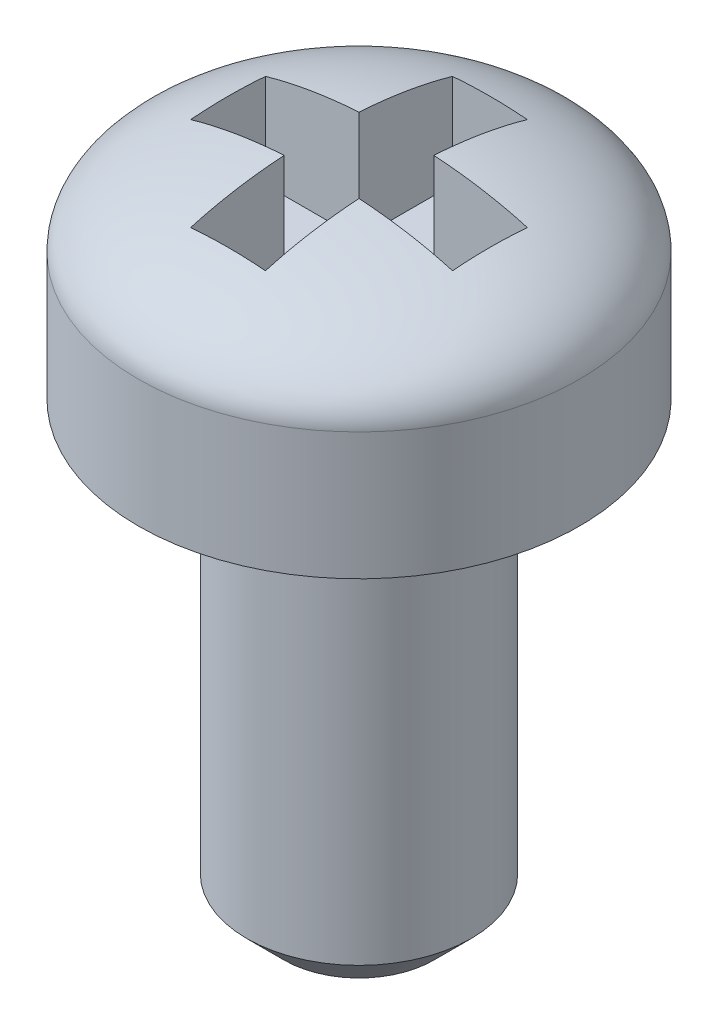
ISO-10303-21;
HEADER;
FILE_DESCRIPTION(('STEP AP214'),'2;1');
FILE_NAME('part.step','',(''),(''),'','','');
FILE_SCHEMA(('AUTOMOTIVE_DESIGN { 1 0 10303 214 1 1 1 1 }'));
ENDSEC;
DATA;
#1=APPLICATION_CONTEXT('core data for automotive mechanical design processes');
#2=APPLICATION_PROTOCOL_DEFINITION('international standard','automotive_design',2000,#1);
#3=PRODUCT_CONTEXT('',#1,'mechanical');
#4=PRODUCT('Part','Part','',(#3));
#5=PRODUCT_RELATED_PRODUCT_CATEGORY('part','',(#4));
#6=PRODUCT_DEFINITION_FORMATION('','',#4);
#7=PRODUCT_DEFINITION_CONTEXT('part definition',#1,'design');
#8=PRODUCT_DEFINITION('design','',#6,#7);
#9=PRODUCT_DEFINITION_SHAPE('','',#8);
#10=(LENGTH_UNIT() NAMED_UNIT(*) SI_UNIT(.MILLI.,.METRE.));
#11=(NAMED_UNIT(*) PLANE_ANGLE_UNIT() SI_UNIT($,.RADIAN.));
#12=(NAMED_UNIT(*) SI_UNIT($,.STERADIAN.) SOLID_ANGLE_UNIT());
#13=UNCERTAINTY_MEASURE_WITH_UNIT(LENGTH_MEASURE(1.E-05),#10,'distance_accuracy_value','');
#14=(GEOMETRIC_REPRESENTATION_CONTEXT(3) GLOBAL_UNCERTAINTY_ASSIGNED_CONTEXT((#13)) GLOBAL_UNIT_ASSIGNED_CONTEXT((#10,
#11,#12)) REPRESENTATION_CONTEXT('',''));
#15=CARTESIAN_POINT('',(0.,0.,0.));
#16=DIRECTION('',(0.,0.,1.));
#17=DIRECTION('',(1.,0.,0.));
#18=AXIS2_PLACEMENT_3D('',#15,#16,#17);
#19=CARTESIAN_POINT('',(-1.5,-2.85,0.));
#20=DIRECTION('',(0.,-1.,0.));
#21=DIRECTION('',(0.,0.,-1.));
#22=AXIS2_PLACEMENT_3D('',#19,#20,#21);
#23=PLANE('',#22);
#24=CARTESIAN_POINT('',(0.,-2.85,0.));
#25=DIRECTION('',(0.,1.,0.));
#26=DIRECTION('',(0.,0.,1.));
#27=AXIS2_PLACEMENT_3D('',#24,#25,#26);
#28=CIRCLE('',#27,1.5);
#29=CARTESIAN_POINT('',(0.,-2.85,1.5));
#30=VERTEX_POINT('',#29);
#31=EDGE_CURVE('E349',#30,#30,#28,.T.);
#32=ORIENTED_EDGE('',*,*,#31,.T.);
#33=EDGE_LOOP('',(#32));
#34=FACE_BOUND('',#33,.T.);
#35=CARTESIAN_POINT('',(0.,-2.85,0.));
#36=DIRECTION('',(0.,1.,0.));
#37=DIRECTION('',(0.,0.,1.));
#38=AXIS2_PLACEMENT_3D('',#35,#36,#37);
#39=CIRCLE('',#38,2.95);
#40=CARTESIAN_POINT('',(0.,-2.85,2.95));
#41=VERTEX_POINT('',#40);
#42=EDGE_CURVE('E174',#41,#41,#39,.T.);
#43=ORIENTED_EDGE('',*,*,#42,.F.);
#44=EDGE_LOOP('',(#43));
#45=FACE_BOUND('',#44,.T.);
#46=ADVANCED_FACE('F33',(#34,#45),#23,.T.);
#47=CARTESIAN_POINT('',(0.,0.,0.));
#48=DIRECTION('',(0.,1.,0.));
#49=DIRECTION('',(0.,0.,1.));
#50=AXIS2_PLACEMENT_3D('',#47,#48,#49);
#51=CYLINDRICAL_SURFACE('',#50,1.5);
#52=CARTESIAN_POINT('',(0.,-8.35,0.));
#53=DIRECTION('',(0.,1.,0.));
#54=DIRECTION('',(0.,0.,1.));
#55=AXIS2_PLACEMENT_3D('',#52,#53,#54);
#56=CIRCLE('',#55,1.5);
#57=CARTESIAN_POINT('',(0.,-8.35,1.5));
#58=VERTEX_POINT('',#57);
#59=EDGE_CURVE('E358',#58,#58,#56,.T.);
#60=ORIENTED_EDGE('',*,*,#59,.T.);
#61=EDGE_LOOP('',(#60));
#62=FACE_BOUND('',#61,.T.);
#63=ORIENTED_EDGE('',*,*,#31,.F.);
#64=EDGE_LOOP('',(#63));
#65=FACE_BOUND('',#64,.T.);
#66=ADVANCED_FACE('F339',(#62,#65),#51,.T.);
#67=CARTESIAN_POINT('',(0.,-8.35,0.));
#68=DIRECTION('',(0.,1.,0.));
#69=DIRECTION('',(0.,0.,1.));
#70=AXIS2_PLACEMENT_3D('',#67,#68,#69);
#71=CONICAL_SURFACE('',#70,1.5,0.785398163397448);
#72=CARTESIAN_POINT('',(0.,-8.85,0.));
#73=DIRECTION('',(0.,1.,0.));
#74=DIRECTION('',(0.,0.,1.));
#75=AXIS2_PLACEMENT_3D('',#72,#73,#74);
#76=CIRCLE('',#75,1.);
#77=CARTESIAN_POINT('',(0.,-8.85,1.));
#78=VERTEX_POINT('',#77);
#79=EDGE_CURVE('E354',#78,#78,#76,.T.);
#80=ORIENTED_EDGE('',*,*,#79,.T.);
#81=EDGE_LOOP('',(#80));
#82=FACE_BOUND('',#81,.T.);
#83=ORIENTED_EDGE('',*,*,#59,.F.);
#84=EDGE_LOOP('',(#83));
#85=FACE_BOUND('',#84,.T.);
#86=ADVANCED_FACE('F344',(#82,#85),#71,.T.);
#87=CARTESIAN_POINT('',(-1.,-8.85,0.));
#88=DIRECTION('',(0.,-1.,0.));
#89=DIRECTION('',(0.,0.,-1.));
#90=AXIS2_PLACEMENT_3D('',#87,#88,#89);
#91=PLANE('',#90);
#92=ORIENTED_EDGE('',*,*,#79,.F.);
#93=EDGE_LOOP('',(#92));
#94=FACE_BOUND('',#93,.T.);
#95=ADVANCED_FACE('F211',(#94),#91,.T.);
#96=CARTESIAN_POINT('',(0.,-1.15,0.));
#97=DIRECTION('',(0.,0.,1.));
#98=DIRECTION('',(-1.,0.,0.));
#99=AXIS2_PLACEMENT_3D('',#96,#97,#98);
#100=ELLIPSE('',#99,2.95,1.15);
#101=TRIMMED_CURVE('',#100,(PARAMETER_VALUE(4.71238898038469)),
(PARAMETER_VALUE(7.85398163397448)),.T.,.PARAMETER.);
#102=CARTESIAN_POINT('',(0.,0.,0.));
#103=DIRECTION('',(0.,1.,0.));
#104=AXIS1_PLACEMENT('',#102,#103);
#105=SURFACE_OF_REVOLUTION('',#101,#104);
#106=CARTESIAN_POINT('',(-1.75,-0.244954930089459,-0.5));
#107=CARTESIAN_POINT('',(-1.75,-0.239055899217544,-0.429623773528876));
#108=CARTESIAN_POINT('',(-1.75,-0.234434513188987,-0.359142635173549));
#109=CARTESIAN_POINT('',(-1.75,-0.227695705444164,-0.218052982729986));
#110=CARTESIAN_POINT('',(-1.75,-0.225578547700344,-0.147444455999186));
#111=CARTESIAN_POINT('',(-1.75,-0.22380070777497,-0.00640476636160792));
#112=CARTESIAN_POINT('',(-1.75,-0.224132829299537,0.0640263084066678));
#113=CARTESIAN_POINT('',(-1.75,-0.227243520783589,0.204829284209098));
#114=CARTESIAN_POINT('',(-1.75,-0.230021863146145,0.275201190138651));
#115=CARTESIAN_POINT('',(-1.75,-0.23700953045186,0.397045446650267));
#116=CARTESIAN_POINT('',(-1.75,-0.240639394362753,0.4485515688106));
#117=CARTESIAN_POINT('',(-1.75,-0.244954930089459,0.5));
#118=B_SPLINE_CURVE_WITH_KNOTS('',3,(#106,#107,#108,#109,#110,#111,#112,#113,#114,#115,#116,
#117),.UNSPECIFIED.,.F.,.F.,(4,2,2,2,2,4),(0.,0.211854281950329,0.423730893618407,
0.634985233414471,0.846219920136794,1.00110398992635),.UNSPECIFIED.);
#119=CARTESIAN_POINT('',(-1.75,-0.244954930089459,-0.5));
#120=VERTEX_POINT('',#119);
#121=CARTESIAN_POINT('',(-1.75,-0.244954930089458,0.5));
#122=VERTEX_POINT('',#121);
#123=EDGE_CURVE('E11',#120,#122,#118,.T.);
#124=ORIENTED_EDGE('',*,*,#123,.F.);
#125=CARTESIAN_POINT('',(-0.500000000000001,-0.0335251515008382,-0.5));
#126=CARTESIAN_POINT('',(-0.552921909872911,-0.0371288185947735,-0.5));
#127=CARTESIAN_POINT('',(-0.605805176989744,-0.0413153124035571,-0.5));
#128=CARTESIAN_POINT('',(-0.71135875930839,-0.0508848716837407,-0.5));
#129=CARTESIAN_POINT('',(-0.764029288729441,-0.0562655779373815,-0.5));
#130=CARTESIAN_POINT('',(-0.869153931793603,-0.0682596903272732,-0.5));
#131=CARTESIAN_POINT('',(-0.921608247327322,-0.0748713203811506,-0.5));
#132=CARTESIAN_POINT('',(-1.02629435328404,-0.0893812865474052,-0.5));
#133=CARTESIAN_POINT('',(-1.07852629323845,-0.0972785408067306,-0.5));
#134=CARTESIAN_POINT('',(-1.18278497192408,-0.114434997072018,-0.5));
#135=CARTESIAN_POINT('',(-1.2348116352868,-0.123694658758267,-0.5));
#136=CARTESIAN_POINT('',(-1.33861697899558,-0.143666671988368,-0.5));
#137=CARTESIAN_POINT('',(-1.39039550065037,-0.154379850609543,-0.5));
#138=CARTESIAN_POINT('',(-1.49367981674456,-0.17737716054057,-0.5));
#139=CARTESIAN_POINT('',(-1.5451851355688,-0.189663441752911,-0.5));
#140=CARTESIAN_POINT('',(-1.64788316046347,-0.215972267379013,-0.5));
#141=CARTESIAN_POINT('',(-1.69907479965767,-0.229998967571266,-0.5));
#142=CARTESIAN_POINT('',(-1.75,-0.244954930089459,-0.500000000000001));
#143=B_SPLINE_CURVE_WITH_KNOTS('',3,(#125,#126,#127,#128,#129,#130,#131,#132,#133,#134,#135,
#136,#137,#138,#139,#140,#141,#142),.UNSPECIFIED.,.F.,.F.,(4,2,2,2,2,2,2,2,4),(0.,
0.159131693146851,0.317951769650337,0.476544438411719,0.63500433478115,0.793517819115162,
0.952121881747135,1.11094506390786,1.27015505874565),.UNSPECIFIED.);
#144=CARTESIAN_POINT('',(-0.5,-0.0335251515008383,-0.5));
#145=VERTEX_POINT('',#144);
#146=EDGE_CURVE('E45',#145,#120,#143,.T.);
#147=ORIENTED_EDGE('',*,*,#146,.F.);
#148=CARTESIAN_POINT('',(-0.5,-0.244954930089459,-1.75));
#149=CARTESIAN_POINT('',(-0.5,-0.225028807203924,-1.68210807496917));
#150=CARTESIAN_POINT('',(-0.5,-0.206738491718709,-1.61375401571976));
#151=CARTESIAN_POINT('',(-0.5,-0.173121024484581,-1.47634042612548));
#152=CARTESIAN_POINT('',(-0.5,-0.157792977452925,-1.40728111559209));
#153=CARTESIAN_POINT('',(-0.5,-0.129829463786077,-1.268879725861));
#154=CARTESIAN_POINT('',(-0.5,-0.117184663373122,-1.19953951133483));
#155=CARTESIAN_POINT('',(-0.5,-0.09431310374636,-1.06046010033589));
#156=CARTESIAN_POINT('',(-0.500000000000001,-0.0840864415700362,-0.990720887966706));
#157=CARTESIAN_POINT('',(-0.500000000000001,-0.0658977167848406,-0.850998112078851));
#158=CARTESIAN_POINT('',(-0.500000000000001,-0.0579341197011642,-0.781014746857256));
#159=CARTESIAN_POINT('',(-0.5,-0.0441442644246511,-0.640709948748605));
#160=CARTESIAN_POINT('',(-0.5,-0.0383218800814352,-0.570388134052562));
#161=CARTESIAN_POINT('',(-0.499999999999999,-0.0335251515008381,-0.5));
#162=B_SPLINE_CURVE_WITH_KNOTS('',3,(#148,#149,#150,#151,#152,#153,#154,#155,#156,#157,#158,
#159,#160,#161),.UNSPECIFIED.,.F.,.F.,(4,2,2,2,2,2,4),(0.,0.212221475197498,0.424378710309311,
0.635785390898001,0.847200553587461,1.0584720219827,1.27012386071645),.UNSPECIFIED.);
#163=CARTESIAN_POINT('',(-0.5,-0.244954930089459,-1.75));
#164=VERTEX_POINT('',#163);
#165=EDGE_CURVE('E281',#164,#145,#162,.T.);
#166=ORIENTED_EDGE('',*,*,#165,.F.);
#167=CARTESIAN_POINT('',(0.499999999999999,-0.244954930089459,-1.75));
#168=CARTESIAN_POINT('',(0.429623773528875,-0.239055899217544,-1.75));
#169=CARTESIAN_POINT('',(0.359142635173548,-0.234434513188987,-1.75));
#170=CARTESIAN_POINT('',(0.218052982729985,-0.227695705444164,-1.75));
#171=CARTESIAN_POINT('',(0.147444455999185,-0.225578547700344,-1.75));
#172=CARTESIAN_POINT('',(0.00640476636160687,-0.22380070777497,-1.75));
#173=CARTESIAN_POINT('',(-0.064026308406669,-0.224132829299537,-1.75));
#174=CARTESIAN_POINT('',(-0.204829284209099,-0.227243520783589,-1.75));
#175=CARTESIAN_POINT('',(-0.275201190138652,-0.230021863146145,-1.75));
#176=CARTESIAN_POINT('',(-0.397045446650268,-0.23700953045186,-1.75));
#177=CARTESIAN_POINT('',(-0.4485515688106,-0.240639394362753,-1.75));
#178=CARTESIAN_POINT('',(-0.5,-0.244954930089459,-1.75));
#179=B_SPLINE_CURVE_WITH_KNOTS('',3,(#167,#168,#169,#170,#171,#172,#173,#174,#175,#176,#177,
#178),.UNSPECIFIED.,.F.,.F.,(4,2,2,2,2,4),(0.,0.211854281950329,0.423730893618408,
0.634985233414471,0.846219920136795,1.00110398992635),.UNSPECIFIED.);
#180=CARTESIAN_POINT('',(0.5,-0.244954930089459,-1.75));
#181=VERTEX_POINT('',#180);
#182=EDGE_CURVE('E275',#181,#164,#179,.T.);
#183=ORIENTED_EDGE('',*,*,#182,.F.);
#184=CARTESIAN_POINT('',(0.499999999999998,-0.0335251515008377,-0.500000000000002));
#185=CARTESIAN_POINT('',(0.499999999999999,-0.0371288185947734,-0.552921909872912));
#186=CARTESIAN_POINT('',(0.499999999999999,-0.0413153124035571,-0.605805176989744));
#187=CARTESIAN_POINT('',(0.5,-0.0508848716837408,-0.711358759308391));
#188=CARTESIAN_POINT('',(0.5,-0.0562655779373816,-0.764029288729441));
#189=CARTESIAN_POINT('',(0.5,-0.0682596903272732,-0.869153931793603));
#190=CARTESIAN_POINT('',(0.5,-0.0748713203811506,-0.921608247327323));
#191=CARTESIAN_POINT('',(0.5,-0.0893812865474052,-1.02629435328404));
#192=CARTESIAN_POINT('',(0.5,-0.0972785408067306,-1.07852629323845));
#193=CARTESIAN_POINT('',(0.5,-0.114434997072018,-1.18278497192408));
#194=CARTESIAN_POINT('',(0.5,-0.123694658758267,-1.2348116352868));
#195=CARTESIAN_POINT('',(0.5,-0.143666671988368,-1.33861697899558));
#196=CARTESIAN_POINT('',(0.5,-0.154379850609543,-1.39039550065037));
#197=CARTESIAN_POINT('',(0.5,-0.17737716054057,-1.49367981674456));
#198=CARTESIAN_POINT('',(0.5,-0.189663441752911,-1.5451851355688));
#199=CARTESIAN_POINT('',(0.5,-0.215972267379013,-1.64788316046347));
#200=CARTESIAN_POINT('',(0.499999999999999,-0.229998967571266,-1.69907479965767));
#201=CARTESIAN_POINT('',(0.499999999999999,-0.244954930089459,-1.75));
#202=B_SPLINE_CURVE_WITH_KNOTS('',3,(#184,#185,#186,#187,#188,#189,#190,#191,#192,#193,#194,
#195,#196,#197,#198,#199,#200,#201),.UNSPECIFIED.,.F.,.F.,(4,2,2,2,2,2,2,2,4),(0.,
0.159131693146851,0.317951769650337,0.476544438411719,0.63500433478115,0.793517819115163,
0.952121881747135,1.11094506390786,1.27015505874565),.UNSPECIFIED.);
#203=CARTESIAN_POINT('',(0.5,-0.0335251515008377,-0.5));
#204=VERTEX_POINT('',#203);
#205=EDGE_CURVE('E268',#204,#181,#202,.T.);
#206=ORIENTED_EDGE('',*,*,#205,.F.);
#207=CARTESIAN_POINT('',(1.75,-0.244954930089459,-0.5));
#208=CARTESIAN_POINT('',(1.68210807496917,-0.225028807203924,-0.5));
#209=CARTESIAN_POINT('',(1.61375401571976,-0.206738491718708,-0.5));
#210=CARTESIAN_POINT('',(1.47634042612548,-0.173121024484581,-0.5));
#211=CARTESIAN_POINT('',(1.40728111559209,-0.157792977452925,-0.5));
#212=CARTESIAN_POINT('',(1.268879725861,-0.129829463786077,-0.5));
#213=CARTESIAN_POINT('',(1.19953951133483,-0.117184663373122,-0.5));
#214=CARTESIAN_POINT('',(1.06046010033589,-0.0943131037463599,-0.5));
#215=CARTESIAN_POINT('',(0.990720887966706,-0.0840864415700362,-0.5));
#216=CARTESIAN_POINT('',(0.850998112078851,-0.0658977167848406,-0.5));
#217=CARTESIAN_POINT('',(0.781014746857255,-0.0579341197011641,-0.5));
#218=CARTESIAN_POINT('',(0.640709948748603,-0.0441442644246508,-0.499999999999999));
#219=CARTESIAN_POINT('',(0.570388134052559,-0.0383218800814348,-0.499999999999999));
#220=CARTESIAN_POINT('',(0.499999999999997,-0.0335251515008377,-0.499999999999999));
#221=B_SPLINE_CURVE_WITH_KNOTS('',3,(#207,#208,#209,#210,#211,#212,#213,#214,#215,#216,#217,
#218,#219,#220),.UNSPECIFIED.,.F.,.F.,(4,2,2,2,2,2,4),(0.,0.212221475197498,0.424378710309311,
0.635785390898001,0.847200553587461,1.0584720219827,1.27012386071645),.UNSPECIFIED.);
#222=CARTESIAN_POINT('',(1.75,-0.244954930089459,-0.5));
#223=VERTEX_POINT('',#222);
#224=EDGE_CURVE('E261',#223,#204,#221,.T.);
#225=ORIENTED_EDGE('',*,*,#224,.F.);
#226=CARTESIAN_POINT('',(1.75,-0.244954930089459,0.5));
#227=CARTESIAN_POINT('',(1.75,-0.239055899217544,0.429623773528876));
#228=CARTESIAN_POINT('',(1.75,-0.234434513188987,0.359142635173549));
#229=CARTESIAN_POINT('',(1.75,-0.227695705444164,0.218052982729986));
#230=CARTESIAN_POINT('',(1.75,-0.225578547700344,0.147444455999186));
#231=CARTESIAN_POINT('',(1.75,-0.22380070777497,0.00640476636160814));
#232=CARTESIAN_POINT('',(1.75,-0.224132829299537,-0.0640263084066676));
#233=CARTESIAN_POINT('',(1.75,-0.227243520783589,-0.204829284209097));
#234=CARTESIAN_POINT('',(1.75,-0.230021863146145,-0.27520119013865));
#235=CARTESIAN_POINT('',(1.75,-0.23700953045186,-0.397045446650267));
#236=CARTESIAN_POINT('',(1.75,-0.240639394362753,-0.448551568810599));
#237=CARTESIAN_POINT('',(1.75,-0.244954930089458,-0.5));
#238=B_SPLINE_CURVE_WITH_KNOTS('',3,(#226,#227,#228,#229,#230,#231,#232,#233,#234,#235,#236,
#237),.UNSPECIFIED.,.F.,.F.,(4,2,2,2,2,4),(0.,0.211854281950329,0.423730893618407,
0.634985233414471,0.846219920136794,1.00110398992635),.UNSPECIFIED.);
#239=CARTESIAN_POINT('',(1.75,-0.244954930089459,0.5));
#240=VERTEX_POINT('',#239);
#241=EDGE_CURVE('E254',#240,#223,#238,.T.);
#242=ORIENTED_EDGE('',*,*,#241,.F.);
#243=CARTESIAN_POINT('',(0.499999999999999,-0.0335251515008381,0.5));
#244=CARTESIAN_POINT('',(0.55292190987291,-0.0371288185947734,0.5));
#245=CARTESIAN_POINT('',(0.605805176989742,-0.041315312403557,0.5));
#246=CARTESIAN_POINT('',(0.711358759308389,-0.0508848716837406,0.5));
#247=CARTESIAN_POINT('',(0.764029288729439,-0.0562655779373814,0.5));
#248=CARTESIAN_POINT('',(0.869153931793601,-0.0682596903272731,0.5));
#249=CARTESIAN_POINT('',(0.921608247327321,-0.0748713203811504,0.5));
#250=CARTESIAN_POINT('',(1.02629435328404,-0.089381286547405,0.5));
#251=CARTESIAN_POINT('',(1.07852629323845,-0.0972785408067304,0.5));
#252=CARTESIAN_POINT('',(1.18278497192407,-0.114434997072018,0.5));
#253=CARTESIAN_POINT('',(1.2348116352868,-0.123694658758267,0.5));
#254=CARTESIAN_POINT('',(1.33861697899558,-0.143666671988368,0.5));
#255=CARTESIAN_POINT('',(1.39039550065037,-0.154379850609543,0.5));
#256=CARTESIAN_POINT('',(1.49367981674456,-0.17737716054057,0.5));
#257=CARTESIAN_POINT('',(1.5451851355688,-0.189663441752911,0.5));
#258=CARTESIAN_POINT('',(1.64788316046347,-0.215972267379013,0.5));
#259=CARTESIAN_POINT('',(1.69907479965767,-0.229998967571266,0.5));
#260=CARTESIAN_POINT('',(1.75,-0.244954930089459,0.500000000000001));
#261=B_SPLINE_CURVE_WITH_KNOTS('',3,(#243,#244,#245,#246,#247,#248,#249,#250,#251,#252,#253,
#254,#255,#256,#257,#258,#259,#260),.UNSPECIFIED.,.F.,.F.,(4,2,2,2,2,2,2,2,4),(0.,
0.159131693146851,0.317951769650337,0.47654443841172,0.63500433478115,0.793517819115164,
0.952121881747136,1.11094506390786,1.27015505874565),.UNSPECIFIED.);
#262=CARTESIAN_POINT('',(0.499999999999999,-0.0335251515008381,0.5));
#263=VERTEX_POINT('',#262);
#264=EDGE_CURVE('E247',#263,#240,#261,.T.);
#265=ORIENTED_EDGE('',*,*,#264,.F.);
#266=CARTESIAN_POINT('',(0.5,-0.244954930089459,1.75));
#267=CARTESIAN_POINT('',(0.5,-0.225028807203924,1.68210807496917));
#268=CARTESIAN_POINT('',(0.5,-0.206738491718709,1.61375401571976));
#269=CARTESIAN_POINT('',(0.5,-0.173121024484581,1.47634042612548));
#270=CARTESIAN_POINT('',(0.5,-0.157792977452925,1.40728111559209));
#271=CARTESIAN_POINT('',(0.5,-0.129829463786077,1.268879725861));
#272=CARTESIAN_POINT('',(0.5,-0.117184663373122,1.19953951133483));
#273=CARTESIAN_POINT('',(0.5,-0.0943131037463595,1.06046010033589));
#274=CARTESIAN_POINT('',(0.499999999999999,-0.0840864415700357,0.990720887966704));
#275=CARTESIAN_POINT('',(0.499999999999999,-0.0658977167848403,0.85099811207885));
#276=CARTESIAN_POINT('',(0.499999999999999,-0.057934119701164,0.781014746857254));
#277=CARTESIAN_POINT('',(0.5,-0.044144264424651,0.640709948748605));
#278=CARTESIAN_POINT('',(0.5,-0.0383218800814352,0.570388134052562));
#279=CARTESIAN_POINT('',(0.499999999999999,-0.0335251515008381,0.5));
#280=B_SPLINE_CURVE_WITH_KNOTS('',3,(#266,#267,#268,#269,#270,#271,#272,#273,#274,#275,#276,
#277,#278,#279),.UNSPECIFIED.,.F.,.F.,(4,2,2,2,2,2,4),(0.,0.212221475197499,0.424378710309311,
0.635785390898002,0.847200553587463,1.0584720219827,1.27012386071645),.UNSPECIFIED.);
#281=CARTESIAN_POINT('',(0.5,-0.244954930089459,1.75));
#282=VERTEX_POINT('',#281);
#283=EDGE_CURVE('E240',#282,#263,#280,.T.);
#284=ORIENTED_EDGE('',*,*,#283,.F.);
#285=CARTESIAN_POINT('',(-0.5,-0.244954930089459,1.75));
#286=CARTESIAN_POINT('',(-0.429623773528876,-0.239055899217544,1.75));
#287=CARTESIAN_POINT('',(-0.359142635173549,-0.234434513188987,1.75));
#288=CARTESIAN_POINT('',(-0.218052982729986,-0.227695705444164,1.75));
#289=CARTESIAN_POINT('',(-0.147444455999186,-0.225578547700344,1.75));
#290=CARTESIAN_POINT('',(-0.00640476636160828,-0.22380070777497,1.75));
#291=CARTESIAN_POINT('',(0.0640263084066674,-0.224132829299537,1.75));
#292=CARTESIAN_POINT('',(0.204829284209097,-0.227243520783589,1.75));
#293=CARTESIAN_POINT('',(0.27520119013865,-0.230021863146145,1.75));
#294=CARTESIAN_POINT('',(0.397045446650267,-0.23700953045186,1.75));
#295=CARTESIAN_POINT('',(0.448551568810599,-0.240639394362753,1.75));
#296=CARTESIAN_POINT('',(0.499999999999999,-0.244954930089458,1.75));
#297=B_SPLINE_CURVE_WITH_KNOTS('',3,(#285,#286,#287,#288,#289,#290,#291,#292,#293,#294,#295,
#296),.UNSPECIFIED.,.F.,.F.,(4,2,2,2,2,4),(0.,0.211854281950329,0.423730893618407,
0.63498523341447,0.846219920136794,1.00110398992635),.UNSPECIFIED.);
#298=CARTESIAN_POINT('',(-0.5,-0.244954930089459,1.75));
#299=VERTEX_POINT('',#298);
#300=EDGE_CURVE('E233',#299,#282,#297,.T.);
#301=ORIENTED_EDGE('',*,*,#300,.F.);
#302=CARTESIAN_POINT('',(-0.5,-0.0335251515008381,0.5));
#303=CARTESIAN_POINT('',(-0.5,-0.0371288185947735,0.55292190987291));
#304=CARTESIAN_POINT('',(-0.5,-0.041315312403557,0.605805176989743));
#305=CARTESIAN_POINT('',(-0.5,-0.0508848716837406,0.711358759308389));
#306=CARTESIAN_POINT('',(-0.5,-0.0562655779373814,0.76402928872944));
#307=CARTESIAN_POINT('',(-0.5,-0.0682596903272731,0.869153931793602));
#308=CARTESIAN_POINT('',(-0.5,-0.0748713203811505,0.921608247327321));
#309=CARTESIAN_POINT('',(-0.5,-0.0893812865474051,1.02629435328404));
#310=CARTESIAN_POINT('',(-0.5,-0.0972785408067304,1.07852629323845));
#311=CARTESIAN_POINT('',(-0.5,-0.114434997072018,1.18278497192407));
#312=CARTESIAN_POINT('',(-0.5,-0.123694658758267,1.2348116352868));
#313=CARTESIAN_POINT('',(-0.5,-0.143666671988368,1.33861697899558));
#314=CARTESIAN_POINT('',(-0.5,-0.154379850609543,1.39039550065037));
#315=CARTESIAN_POINT('',(-0.5,-0.17737716054057,1.49367981674456));
#316=CARTESIAN_POINT('',(-0.5,-0.189663441752911,1.5451851355688));
#317=CARTESIAN_POINT('',(-0.5,-0.215972267379013,1.64788316046347));
#318=CARTESIAN_POINT('',(-0.5,-0.229998967571266,1.69907479965767));
#319=CARTESIAN_POINT('',(-0.5,-0.244954930089459,1.75));
#320=B_SPLINE_CURVE_WITH_KNOTS('',3,(#302,#303,#304,#305,#306,#307,#308,#309,#310,#311,#312,
#313,#314,#315,#316,#317,#318,#319),.UNSPECIFIED.,.F.,.F.,(4,2,2,2,2,2,2,2,4),(0.,
0.159131693146851,0.317951769650337,0.47654443841172,0.63500433478115,0.793517819115163,
0.952121881747136,1.11094506390786,1.27015505874565),.UNSPECIFIED.);
#321=CARTESIAN_POINT('',(-0.5,-0.0335251515008381,0.5));
#322=VERTEX_POINT('',#321);
#323=EDGE_CURVE('E226',#322,#299,#320,.T.);
#324=ORIENTED_EDGE('',*,*,#323,.F.);
#325=CARTESIAN_POINT('',(-1.75,-0.244954930089458,0.5));
#326=CARTESIAN_POINT('',(-1.68210807496917,-0.225028807203924,0.5));
#327=CARTESIAN_POINT('',(-1.61375401571976,-0.206738491718708,0.5));
#328=CARTESIAN_POINT('',(-1.47634042612548,-0.173121024484581,0.5));
#329=CARTESIAN_POINT('',(-1.40728111559208,-0.157792977452925,0.5));
#330=CARTESIAN_POINT('',(-1.268879725861,-0.129829463786077,0.5));
#331=CARTESIAN_POINT('',(-1.19953951133483,-0.117184663373122,0.5));
#332=CARTESIAN_POINT('',(-1.06046010033589,-0.0943131037463594,0.5));
#333=CARTESIAN_POINT('',(-0.990720887966704,-0.0840864415700357,0.5));
#334=CARTESIAN_POINT('',(-0.850998112078849,-0.0658977167848403,0.5));
#335=CARTESIAN_POINT('',(-0.781014746857254,-0.057934119701164,0.5));
#336=CARTESIAN_POINT('',(-0.640709948748604,-0.044144264424651,0.5));
#337=CARTESIAN_POINT('',(-0.570388134052561,-0.0383218800814351,0.5));
#338=CARTESIAN_POINT('',(-0.5,-0.0335251515008381,0.5));
#339=B_SPLINE_CURVE_WITH_KNOTS('',3,(#325,#326,#327,#328,#329,#330,#331,#332,#333,#334,#335,
#336,#337,#338),.UNSPECIFIED.,.F.,.F.,(4,2,2,2,2,2,4),(0.,0.212221475197498,0.424378710309311,
0.635785390898002,0.847200553587463,1.0584720219827,1.27012386071645),.UNSPECIFIED.);
#340=EDGE_CURVE('E217',#122,#322,#339,.T.);
#341=ORIENTED_EDGE('',*,*,#340,.F.);
#342=EDGE_LOOP('',(#124,#147,#166,#183,#206,#225,#242,#265,#284,#301,#324,#341));
#343=FACE_BOUND('',#342,.T.);
#344=CARTESIAN_POINT('',(0.,-1.15,0.));
#345=DIRECTION('',(0.,1.,0.));
#346=DIRECTION('',(0.,0.,1.));
#347=AXIS2_PLACEMENT_3D('',#344,#345,#346);
#348=CIRCLE('',#347,2.95);
#349=CARTESIAN_POINT('',(0.,-1.15,2.95));
#350=VERTEX_POINT('',#349);
#351=EDGE_CURVE('E352',#350,#350,#348,.T.);
#352=ORIENTED_EDGE('',*,*,#351,.T.);
#353=EDGE_LOOP('',(#352));
#354=FACE_BOUND('',#353,.T.);
#355=ADVANCED_FACE('F205',(#343,#354),#105,.F.);
#356=CARTESIAN_POINT('',(0.,0.,0.));
#357=DIRECTION('',(0.,1.,0.));
#358=DIRECTION('',(0.,0.,1.));
#359=AXIS2_PLACEMENT_3D('',#356,#357,#358);
#360=CYLINDRICAL_SURFACE('',#359,2.95);
#361=ORIENTED_EDGE('',*,*,#42,.T.);
#362=EDGE_LOOP('',(#361));
#363=FACE_BOUND('',#362,.T.);
#364=ORIENTED_EDGE('',*,*,#351,.F.);
#365=EDGE_LOOP('',(#364));
#366=FACE_BOUND('',#365,.T.);
#367=ADVANCED_FACE('F210',(#363,#366),#360,.T.);
#368=CARTESIAN_POINT('',(-1.75,-1.5,-0.5));
#369=DIRECTION('',(-1.,0.,0.));
#370=DIRECTION('',(0.,0.,1.));
#371=AXIS2_PLACEMENT_3D('',#368,#369,#370);
#372=PLANE('',#371);
#373=ORIENTED_EDGE('',*,*,#123,.T.);
#374=DIRECTION('',(0.,1.,0.));
#375=VECTOR('',#374,1.);
#376=CARTESIAN_POINT('',(-1.75,-1.5,0.5));
#377=LINE('',#376,#375);
#378=CARTESIAN_POINT('',(-1.75,-1.5,0.5));
#379=VERTEX_POINT('',#378);
#380=EDGE_CURVE('E52',#379,#122,#377,.T.);
#381=ORIENTED_EDGE('',*,*,#380,.F.);
#382=DIRECTION('',(0.,0.,1.));
#383=VECTOR('',#382,1.);
#384=CARTESIAN_POINT('',(-1.75,-1.5,-0.5));
#385=LINE('',#384,#383);
#386=CARTESIAN_POINT('',(-1.75,-1.5,-0.5));
#387=VERTEX_POINT('',#386);
#388=EDGE_CURVE('E126',#387,#379,#385,.T.);
#389=ORIENTED_EDGE('',*,*,#388,.F.);
#390=DIRECTION('',(0.,1.,0.));
#391=VECTOR('',#390,1.);
#392=CARTESIAN_POINT('',(-1.75,-1.5,-0.5));
#393=LINE('',#392,#391);
#394=EDGE_CURVE('E172',#387,#120,#393,.T.);
#395=ORIENTED_EDGE('',*,*,#394,.T.);
#396=EDGE_LOOP('',(#373,#381,#389,#395));
#397=FACE_BOUND('',#396,.T.);
#398=ADVANCED_FACE('F124',(#397),#372,.F.);
#399=CARTESIAN_POINT('',(-1.75,-1.5,-0.5));
#400=DIRECTION('',(0.,0.,-1.));
#401=DIRECTION('',(-1.,0.,0.));
#402=AXIS2_PLACEMENT_3D('',#399,#400,#401);
#403=PLANE('',#402);
#404=ORIENTED_EDGE('',*,*,#146,.T.);
#405=ORIENTED_EDGE('',*,*,#394,.F.);
#406=DIRECTION('',(-1.,0.,0.));
#407=VECTOR('',#406,1.);
#408=CARTESIAN_POINT('',(-1.75,-1.5,-0.5));
#409=LINE('',#408,#407);
#410=CARTESIAN_POINT('',(-0.5,-1.5,-0.5));
#411=VERTEX_POINT('',#410);
#412=EDGE_CURVE('E131',#411,#387,#409,.T.);
#413=ORIENTED_EDGE('',*,*,#412,.F.);
#414=DIRECTION('',(0.,1.,0.));
#415=VECTOR('',#414,1.);
#416=CARTESIAN_POINT('',(-0.5,-1.5,-0.5));
#417=LINE('',#416,#415);
#418=EDGE_CURVE('E175',#411,#145,#417,.T.);
#419=ORIENTED_EDGE('',*,*,#418,.T.);
#420=EDGE_LOOP('',(#404,#405,#413,#419));
#421=FACE_BOUND('',#420,.T.);
#422=ADVANCED_FACE('F290',(#421),#403,.F.);
#423=CARTESIAN_POINT('',(-0.5,-1.5,-1.75));
#424=DIRECTION('',(-1.,0.,0.));
#425=DIRECTION('',(0.,0.,1.));
#426=AXIS2_PLACEMENT_3D('',#423,#424,#425);
#427=PLANE('',#426);
#428=ORIENTED_EDGE('',*,*,#165,.T.);
#429=ORIENTED_EDGE('',*,*,#418,.F.);
#430=DIRECTION('',(0.,0.,1.));
#431=VECTOR('',#430,1.);
#432=CARTESIAN_POINT('',(-0.5,-1.5,-1.75));
#433=LINE('',#432,#431);
#434=CARTESIAN_POINT('',(-0.5,-1.5,-1.75));
#435=VERTEX_POINT('',#434);
#436=EDGE_CURVE('E169',#435,#411,#433,.T.);
#437=ORIENTED_EDGE('',*,*,#436,.F.);
#438=DIRECTION('',(0.,1.,0.));
#439=VECTOR('',#438,1.);
#440=CARTESIAN_POINT('',(-0.5,-1.5,-1.75));
#441=LINE('',#440,#439);
#442=EDGE_CURVE('E177',#435,#164,#441,.T.);
#443=ORIENTED_EDGE('',*,*,#442,.T.);
#444=EDGE_LOOP('',(#428,#429,#437,#443));
#445=FACE_BOUND('',#444,.T.);
#446=ADVANCED_FACE('F294',(#445),#427,.F.);
#447=CARTESIAN_POINT('',(-0.5,-1.5,-1.75));
#448=DIRECTION('',(0.,0.,-1.));
#449=DIRECTION('',(-1.,0.,0.));
#450=AXIS2_PLACEMENT_3D('',#447,#448,#449);
#451=PLANE('',#450);
#452=ORIENTED_EDGE('',*,*,#182,.T.);
#453=ORIENTED_EDGE('',*,*,#442,.F.);
#454=DIRECTION('',(-1.,0.,0.));
#455=VECTOR('',#454,1.);
#456=CARTESIAN_POINT('',(-0.5,-1.5,-1.75));
#457=LINE('',#456,#455);
#458=CARTESIAN_POINT('',(0.5,-1.5,-1.75));
#459=VERTEX_POINT('',#458);
#460=EDGE_CURVE('E166',#459,#435,#457,.T.);
#461=ORIENTED_EDGE('',*,*,#460,.F.);
#462=DIRECTION('',(0.,1.,0.));
#463=VECTOR('',#462,1.);
#464=CARTESIAN_POINT('',(0.5,-1.5,-1.75));
#465=LINE('',#464,#463);
#466=EDGE_CURVE('E180',#459,#181,#465,.T.);
#467=ORIENTED_EDGE('',*,*,#466,.T.);
#468=EDGE_LOOP('',(#452,#453,#461,#467));
#469=FACE_BOUND('',#468,.T.);
#470=ADVANCED_FACE('F297',(#469),#451,.F.);
#471=CARTESIAN_POINT('',(0.5,-1.5,-1.75));
#472=DIRECTION('',(1.,0.,0.));
#473=DIRECTION('',(0.,0.,-1.));
#474=AXIS2_PLACEMENT_3D('',#471,#472,#473);
#475=PLANE('',#474);
#476=ORIENTED_EDGE('',*,*,#205,.T.);
#477=ORIENTED_EDGE('',*,*,#466,.F.);
#478=DIRECTION('',(0.,0.,-1.));
#479=VECTOR('',#478,1.);
#480=CARTESIAN_POINT('',(0.5,-1.5,-1.75));
#481=LINE('',#480,#479);
#482=CARTESIAN_POINT('',(0.5,-1.5,-0.5));
#483=VERTEX_POINT('',#482);
#484=EDGE_CURVE('E163',#483,#459,#481,.T.);
#485=ORIENTED_EDGE('',*,*,#484,.F.);
#486=DIRECTION('',(0.,1.,0.));
#487=VECTOR('',#486,1.);
#488=CARTESIAN_POINT('',(0.5,-1.5,-0.5));
#489=LINE('',#488,#487);
#490=EDGE_CURVE('E183',#483,#204,#489,.T.);
#491=ORIENTED_EDGE('',*,*,#490,.T.);
#492=EDGE_LOOP('',(#476,#477,#485,#491));
#493=FACE_BOUND('',#492,.T.);
#494=ADVANCED_FACE('F301',(#493),#475,.F.);
#495=CARTESIAN_POINT('',(0.5,-1.5,-0.5));
#496=DIRECTION('',(0.,0.,-1.));
#497=DIRECTION('',(-1.,0.,0.));
#498=AXIS2_PLACEMENT_3D('',#495,#496,#497);
#499=PLANE('',#498);
#500=ORIENTED_EDGE('',*,*,#224,.T.);
#501=ORIENTED_EDGE('',*,*,#490,.F.);
#502=DIRECTION('',(-1.,0.,0.));
#503=VECTOR('',#502,1.);
#504=CARTESIAN_POINT('',(0.5,-1.5,-0.5));
#505=LINE('',#504,#503);
#506=CARTESIAN_POINT('',(1.75,-1.5,-0.5));
#507=VERTEX_POINT('',#506);
#508=EDGE_CURVE('E160',#507,#483,#505,.T.);
#509=ORIENTED_EDGE('',*,*,#508,.F.);
#510=DIRECTION('',(0.,1.,0.));
#511=VECTOR('',#510,1.);
#512=CARTESIAN_POINT('',(1.75,-1.5,-0.5));
#513=LINE('',#512,#511);
#514=EDGE_CURVE('E186',#507,#223,#513,.T.);
#515=ORIENTED_EDGE('',*,*,#514,.T.);
#516=EDGE_LOOP('',(#500,#501,#509,#515));
#517=FACE_BOUND('',#516,.T.);
#518=ADVANCED_FACE('F305',(#517),#499,.F.);
#519=CARTESIAN_POINT('',(1.75,-1.5,-0.5));
#520=DIRECTION('',(1.,0.,0.));
#521=DIRECTION('',(0.,0.,-1.));
#522=AXIS2_PLACEMENT_3D('',#519,#520,#521);
#523=PLANE('',#522);
#524=ORIENTED_EDGE('',*,*,#241,.T.);
#525=ORIENTED_EDGE('',*,*,#514,.F.);
#526=DIRECTION('',(0.,0.,-1.));
#527=VECTOR('',#526,1.);
#528=CARTESIAN_POINT('',(1.75,-1.5,-0.5));
#529=LINE('',#528,#527);
#530=CARTESIAN_POINT('',(1.75,-1.5,0.5));
#531=VERTEX_POINT('',#530);
#532=EDGE_CURVE('E157',#531,#507,#529,.T.);
#533=ORIENTED_EDGE('',*,*,#532,.F.);
#534=DIRECTION('',(0.,1.,0.));
#535=VECTOR('',#534,1.);
#536=CARTESIAN_POINT('',(1.75,-1.5,0.5));
#537=LINE('',#536,#535);
#538=EDGE_CURVE('E189',#531,#240,#537,.T.);
#539=ORIENTED_EDGE('',*,*,#538,.T.);
#540=EDGE_LOOP('',(#524,#525,#533,#539));
#541=FACE_BOUND('',#540,.T.);
#542=ADVANCED_FACE('F309',(#541),#523,.F.);
#543=CARTESIAN_POINT('',(0.499999999999999,-1.5,0.5));
#544=DIRECTION('',(0.,0.,1.));
#545=DIRECTION('',(1.,0.,0.));
#546=AXIS2_PLACEMENT_3D('',#543,#544,#545);
#547=PLANE('',#546);
#548=ORIENTED_EDGE('',*,*,#264,.T.);
#549=ORIENTED_EDGE('',*,*,#538,.F.);
#550=DIRECTION('',(1.,0.,0.));
#551=VECTOR('',#550,1.);
#552=CARTESIAN_POINT('',(0.499999999999999,-1.5,0.5));
#553=LINE('',#552,#551);
#554=CARTESIAN_POINT('',(0.499999999999999,-1.5,0.5));
#555=VERTEX_POINT('',#554);
#556=EDGE_CURVE('E154',#555,#531,#553,.T.);
#557=ORIENTED_EDGE('',*,*,#556,.F.);
#558=DIRECTION('',(0.,1.,0.));
#559=VECTOR('',#558,1.);
#560=CARTESIAN_POINT('',(0.499999999999999,-1.5,0.5));
#561=LINE('',#560,#559);
#562=EDGE_CURVE('E192',#555,#263,#561,.T.);
#563=ORIENTED_EDGE('',*,*,#562,.T.);
#564=EDGE_LOOP('',(#548,#549,#557,#563));
#565=FACE_BOUND('',#564,.T.);
#566=ADVANCED_FACE('F313',(#565),#547,.F.);
#567=CARTESIAN_POINT('',(0.499999999999999,-1.5,0.5));
#568=DIRECTION('',(1.,0.,0.));
#569=DIRECTION('',(0.,0.,-1.));
#570=AXIS2_PLACEMENT_3D('',#567,#568,#569);
#571=PLANE('',#570);
#572=ORIENTED_EDGE('',*,*,#283,.T.);
#573=ORIENTED_EDGE('',*,*,#562,.F.);
#574=DIRECTION('',(0.,0.,-1.));
#575=VECTOR('',#574,1.);
#576=CARTESIAN_POINT('',(0.499999999999999,-1.5,0.5));
#577=LINE('',#576,#575);
#578=CARTESIAN_POINT('',(0.5,-1.5,1.75));
#579=VERTEX_POINT('',#578);
#580=EDGE_CURVE('E151',#579,#555,#577,.T.);
#581=ORIENTED_EDGE('',*,*,#580,.F.);
#582=DIRECTION('',(0.,1.,0.));
#583=VECTOR('',#582,1.);
#584=CARTESIAN_POINT('',(0.5,-1.5,1.75));
#585=LINE('',#584,#583);
#586=EDGE_CURVE('E195',#579,#282,#585,.T.);
#587=ORIENTED_EDGE('',*,*,#586,.T.);
#588=EDGE_LOOP('',(#572,#573,#581,#587));
#589=FACE_BOUND('',#588,.T.);
#590=ADVANCED_FACE('F317',(#589),#571,.F.);
#591=CARTESIAN_POINT('',(-0.5,-1.5,1.75));
#592=DIRECTION('',(0.,0.,1.));
#593=DIRECTION('',(1.,0.,0.));
#594=AXIS2_PLACEMENT_3D('',#591,#592,#593);
#595=PLANE('',#594);
#596=ORIENTED_EDGE('',*,*,#300,.T.);
#597=ORIENTED_EDGE('',*,*,#586,.F.);
#598=DIRECTION('',(1.,0.,0.));
#599=VECTOR('',#598,1.);
#600=CARTESIAN_POINT('',(-0.5,-1.5,1.75));
#601=LINE('',#600,#599);
#602=CARTESIAN_POINT('',(-0.5,-1.5,1.75));
#603=VERTEX_POINT('',#602);
#604=EDGE_CURVE('E148',#603,#579,#601,.T.);
#605=ORIENTED_EDGE('',*,*,#604,.F.);
#606=DIRECTION('',(0.,1.,0.));
#607=VECTOR('',#606,1.);
#608=CARTESIAN_POINT('',(-0.5,-1.5,1.75));
#609=LINE('',#608,#607);
#610=EDGE_CURVE('E198',#603,#299,#609,.T.);
#611=ORIENTED_EDGE('',*,*,#610,.T.);
#612=EDGE_LOOP('',(#596,#597,#605,#611));
#613=FACE_BOUND('',#612,.T.);
#614=ADVANCED_FACE('F321',(#613),#595,.F.);
#615=CARTESIAN_POINT('',(-0.5,-1.5,0.5));
#616=DIRECTION('',(-1.,0.,0.));
#617=DIRECTION('',(0.,0.,1.));
#618=AXIS2_PLACEMENT_3D('',#615,#616,#617);
#619=PLANE('',#618);
#620=ORIENTED_EDGE('',*,*,#323,.T.);
#621=ORIENTED_EDGE('',*,*,#610,.F.);
#622=DIRECTION('',(0.,0.,1.));
#623=VECTOR('',#622,1.);
#624=CARTESIAN_POINT('',(-0.5,-1.5,0.5));
#625=LINE('',#624,#623);
#626=CARTESIAN_POINT('',(-0.5,-1.5,0.5));
#627=VERTEX_POINT('',#626);
#628=EDGE_CURVE('E140',#627,#603,#625,.T.);
#629=ORIENTED_EDGE('',*,*,#628,.F.);
#630=DIRECTION('',(0.,1.,0.));
#631=VECTOR('',#630,1.);
#632=CARTESIAN_POINT('',(-0.5,-1.5,0.5));
#633=LINE('',#632,#631);
#634=EDGE_CURVE('E130',#627,#322,#633,.T.);
#635=ORIENTED_EDGE('',*,*,#634,.T.);
#636=EDGE_LOOP('',(#620,#621,#629,#635));
#637=FACE_BOUND('',#636,.T.);
#638=ADVANCED_FACE('F325',(#637),#619,.F.);
#639=CARTESIAN_POINT('',(-1.75,-1.5,0.5));
#640=DIRECTION('',(0.,0.,1.));
#641=DIRECTION('',(1.,0.,0.));
#642=AXIS2_PLACEMENT_3D('',#639,#640,#641);
#643=PLANE('',#642);
#644=ORIENTED_EDGE('',*,*,#340,.T.);
#645=ORIENTED_EDGE('',*,*,#634,.F.);
#646=DIRECTION('',(1.,0.,0.));
#647=VECTOR('',#646,1.);
#648=CARTESIAN_POINT('',(-1.75,-1.5,0.5));
#649=LINE('',#648,#647);
#650=EDGE_CURVE('E134',#379,#627,#649,.T.);
#651=ORIENTED_EDGE('',*,*,#650,.F.);
#652=ORIENTED_EDGE('',*,*,#380,.T.);
#653=EDGE_LOOP('',(#644,#645,#651,#652));
#654=FACE_BOUND('',#653,.T.);
#655=ADVANCED_FACE('F135',(#654),#643,.F.);
#656=CARTESIAN_POINT('',(0.,-1.5,0.));
#657=DIRECTION('',(0.,1.,0.));
#658=DIRECTION('',(0.,0.,1.));
#659=AXIS2_PLACEMENT_3D('',#656,#657,#658);
#660=PLANE('',#659);
#661=ORIENTED_EDGE('',*,*,#388,.T.);
#662=ORIENTED_EDGE('',*,*,#650,.T.);
#663=ORIENTED_EDGE('',*,*,#628,.T.);
#664=ORIENTED_EDGE('',*,*,#604,.T.);
#665=ORIENTED_EDGE('',*,*,#580,.T.);
#666=ORIENTED_EDGE('',*,*,#556,.T.);
#667=ORIENTED_EDGE('',*,*,#532,.T.);
#668=ORIENTED_EDGE('',*,*,#508,.T.);
#669=ORIENTED_EDGE('',*,*,#484,.T.);
#670=ORIENTED_EDGE('',*,*,#460,.T.);
#671=ORIENTED_EDGE('',*,*,#436,.T.);
#672=ORIENTED_EDGE('',*,*,#412,.T.);
#673=EDGE_LOOP('',(#661,#662,#663,#664,#665,#666,#667,#668,#669,#670,#671,#672));
#674=FACE_BOUND('',#673,.T.);
#675=ADVANCED_FACE('F142',(#674),#660,.T.);
#676=CLOSED_SHELL('',(#46,#66,#86,#95,#355,#367,#398,#422,#446,#470,#494,#518,#542,#566,#590,
#614,#638,#655,#675));
#677=MANIFOLD_SOLID_BREP('B2',#676);
#678=ADVANCED_BREP_SHAPE_REPRESENTATION('',(#18,#677),#14);
#679=SHAPE_DEFINITION_REPRESENTATION(#9,#678);
ENDSEC;
END-ISO-10303-21;
